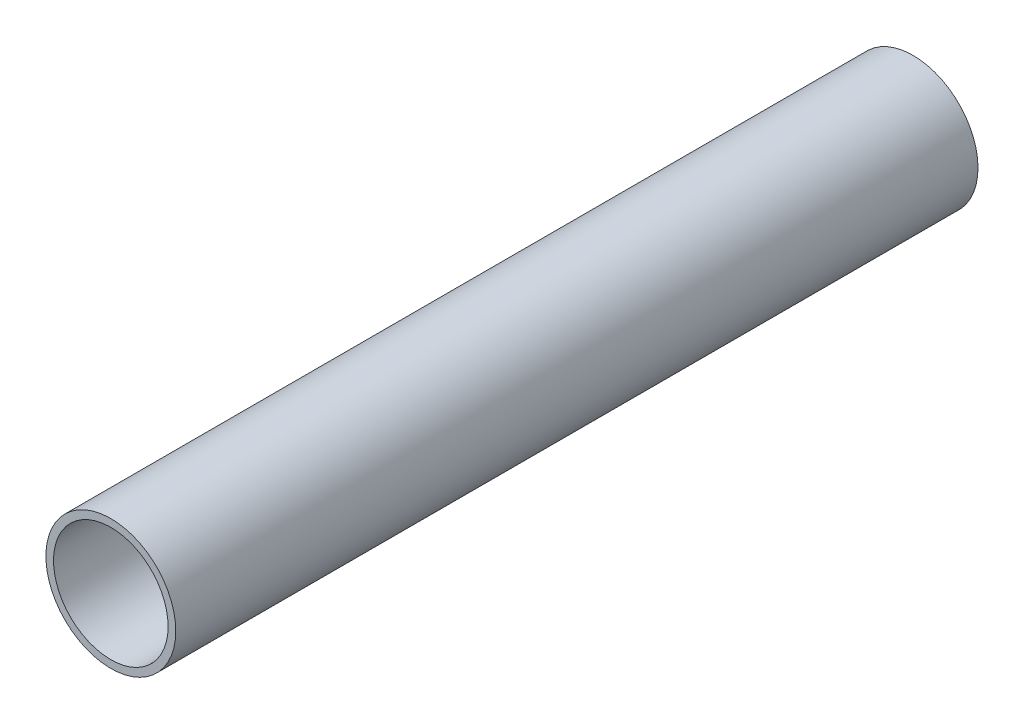
ISO-10303-21;
HEADER;
FILE_DESCRIPTION(('STEP AP214'),'2;1');
FILE_NAME('part.step','',(''),(''),'','','');
FILE_SCHEMA(('AUTOMOTIVE_DESIGN { 1 0 10303 214 1 1 1 1 }'));
ENDSEC;
DATA;
#1=APPLICATION_CONTEXT('core data for automotive mechanical design processes');
#2=APPLICATION_PROTOCOL_DEFINITION('international standard','automotive_design',2000,#1);
#3=PRODUCT_CONTEXT('',#1,'mechanical');
#4=PRODUCT('Part','Part','',(#3));
#5=PRODUCT_RELATED_PRODUCT_CATEGORY('part','',(#4));
#6=PRODUCT_DEFINITION_FORMATION('','',#4);
#7=PRODUCT_DEFINITION_CONTEXT('part definition',#1,'design');
#8=PRODUCT_DEFINITION('design','',#6,#7);
#9=PRODUCT_DEFINITION_SHAPE('','',#8);
#10=(LENGTH_UNIT() NAMED_UNIT(*) SI_UNIT(.MILLI.,.METRE.));
#11=(NAMED_UNIT(*) PLANE_ANGLE_UNIT() SI_UNIT($,.RADIAN.));
#12=(NAMED_UNIT(*) SI_UNIT($,.STERADIAN.) SOLID_ANGLE_UNIT());
#13=UNCERTAINTY_MEASURE_WITH_UNIT(LENGTH_MEASURE(1.E-05),#10,'distance_accuracy_value','');
#14=(GEOMETRIC_REPRESENTATION_CONTEXT(3) GLOBAL_UNCERTAINTY_ASSIGNED_CONTEXT((#13)) GLOBAL_UNIT_ASSIGNED_CONTEXT((#10,
#11,#12)) REPRESENTATION_CONTEXT('',''));
#15=CARTESIAN_POINT('',(0.,0.,0.));
#16=DIRECTION('',(0.,0.,1.));
#17=DIRECTION('',(1.,0.,0.));
#18=AXIS2_PLACEMENT_3D('',#15,#16,#17);
#19=CARTESIAN_POINT('',(0.,0.,105.));
#20=DIRECTION('',(0.,0.,-1.));
#21=DIRECTION('',(-1.,0.,0.));
#22=AXIS2_PLACEMENT_3D('',#19,#20,#21);
#23=CYLINDRICAL_SURFACE('',#22,15.);
#24=CARTESIAN_POINT('',(0.,0.,105.));
#25=DIRECTION('',(0.,0.,1.));
#26=DIRECTION('',(1.,0.,0.));
#27=AXIS2_PLACEMENT_3D('',#24,#25,#26);
#28=CIRCLE('',#27,15.);
#29=CARTESIAN_POINT('',(15.,0.,105.));
#30=VERTEX_POINT('',#29);
#31=EDGE_CURVE('E40',#30,#30,#28,.T.);
#32=ORIENTED_EDGE('',*,*,#31,.T.);
#33=EDGE_LOOP('',(#32));
#34=FACE_BOUND('',#33,.T.);
#35=CARTESIAN_POINT('',(0.,0.,-105.));
#36=DIRECTION('',(0.,0.,1.));
#37=DIRECTION('',(1.,0.,0.));
#38=AXIS2_PLACEMENT_3D('',#35,#36,#37);
#39=CIRCLE('',#38,15.);
#40=CARTESIAN_POINT('',(15.,0.,-105.));
#41=VERTEX_POINT('',#40);
#42=EDGE_CURVE('E46',#41,#41,#39,.T.);
#43=ORIENTED_EDGE('',*,*,#42,.F.);
#44=EDGE_LOOP('',(#43));
#45=FACE_BOUND('',#44,.T.);
#46=ADVANCED_FACE('F33',(#34,#45),#23,.F.);
#47=CARTESIAN_POINT('',(0.,0.,105.));
#48=DIRECTION('',(0.,0.,-1.));
#49=DIRECTION('',(-1.,0.,0.));
#50=AXIS2_PLACEMENT_3D('',#47,#48,#49);
#51=CYLINDRICAL_SURFACE('',#50,17.);
#52=CARTESIAN_POINT('',(0.,0.,105.));
#53=DIRECTION('',(0.,0.,1.));
#54=DIRECTION('',(1.,0.,0.));
#55=AXIS2_PLACEMENT_3D('',#52,#53,#54);
#56=CIRCLE('',#55,17.);
#57=CARTESIAN_POINT('',(17.,0.,105.));
#58=VERTEX_POINT('',#57);
#59=EDGE_CURVE('E10',#58,#58,#56,.T.);
#60=ORIENTED_EDGE('',*,*,#59,.F.);
#61=EDGE_LOOP('',(#60));
#62=FACE_BOUND('',#61,.T.);
#63=CARTESIAN_POINT('',(0.,0.,-105.));
#64=DIRECTION('',(0.,0.,1.));
#65=DIRECTION('',(1.,0.,0.));
#66=AXIS2_PLACEMENT_3D('',#63,#64,#65);
#67=CIRCLE('',#66,17.);
#68=CARTESIAN_POINT('',(17.,0.,-105.));
#69=VERTEX_POINT('',#68);
#70=EDGE_CURVE('E36',#69,#69,#67,.T.);
#71=ORIENTED_EDGE('',*,*,#70,.T.);
#72=EDGE_LOOP('',(#71));
#73=FACE_BOUND('',#72,.T.);
#74=ADVANCED_FACE('F53',(#62,#73),#51,.T.);
#75=CARTESIAN_POINT('',(0.,0.,105.));
#76=DIRECTION('',(0.,0.,1.));
#77=DIRECTION('',(1.,0.,0.));
#78=AXIS2_PLACEMENT_3D('',#75,#76,#77);
#79=PLANE('',#78);
#80=ORIENTED_EDGE('',*,*,#31,.F.);
#81=EDGE_LOOP('',(#80));
#82=FACE_BOUND('',#81,.T.);
#83=ORIENTED_EDGE('',*,*,#59,.T.);
#84=EDGE_LOOP('',(#83));
#85=FACE_BOUND('',#84,.T.);
#86=ADVANCED_FACE('F57',(#82,#85),#79,.T.);
#87=CARTESIAN_POINT('',(0.,0.,-105.));
#88=DIRECTION('',(0.,0.,1.));
#89=DIRECTION('',(1.,0.,0.));
#90=AXIS2_PLACEMENT_3D('',#87,#88,#89);
#91=PLANE('',#90);
#92=ORIENTED_EDGE('',*,*,#42,.T.);
#93=EDGE_LOOP('',(#92));
#94=FACE_BOUND('',#93,.T.);
#95=ORIENTED_EDGE('',*,*,#70,.F.);
#96=EDGE_LOOP('',(#95));
#97=FACE_BOUND('',#96,.T.);
#98=ADVANCED_FACE('F55',(#94,#97),#91,.F.);
#99=CLOSED_SHELL('',(#46,#74,#86,#98));
#100=MANIFOLD_SOLID_BREP('B2',#99);
#101=ADVANCED_BREP_SHAPE_REPRESENTATION('',(#18,#100),#14);
#102=SHAPE_DEFINITION_REPRESENTATION(#9,#101);
ENDSEC;
END-ISO-10303-21;
